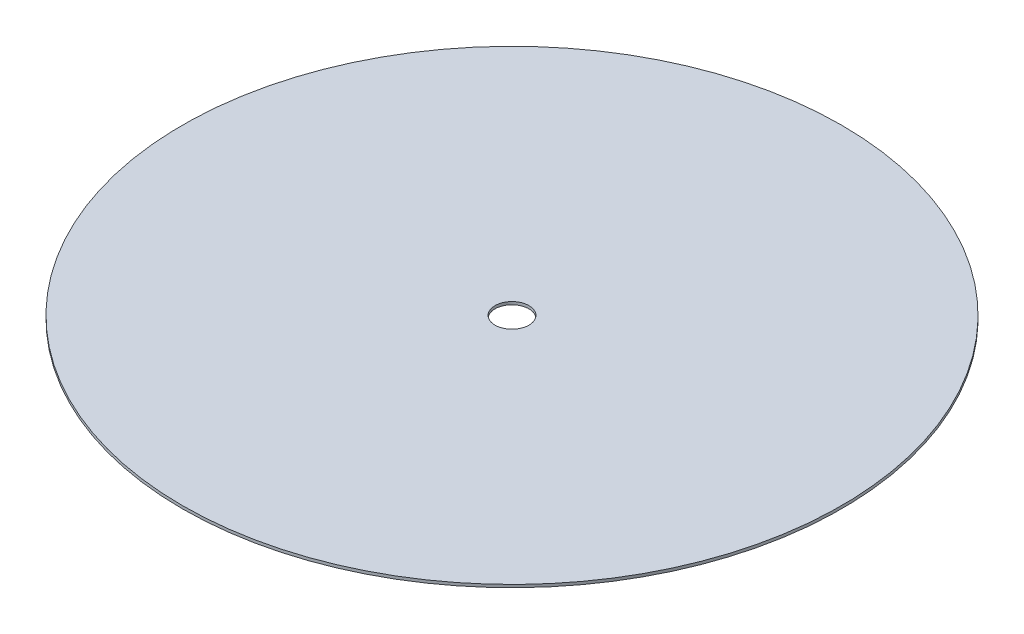
ISO-10303-21;
HEADER;
FILE_DESCRIPTION(('STEP AP214'),'2;1');
FILE_NAME('part.step','',(''),(''),'','','');
FILE_SCHEMA(('AUTOMOTIVE_DESIGN { 1 0 10303 214 1 1 1 1 }'));
ENDSEC;
DATA;
#1=APPLICATION_CONTEXT('core data for automotive mechanical design processes');
#2=APPLICATION_PROTOCOL_DEFINITION('international standard','automotive_design',2000,#1);
#3=PRODUCT_CONTEXT('',#1,'mechanical');
#4=PRODUCT('Part','Part','',(#3));
#5=PRODUCT_RELATED_PRODUCT_CATEGORY('part','',(#4));
#6=PRODUCT_DEFINITION_FORMATION('','',#4);
#7=PRODUCT_DEFINITION_CONTEXT('part definition',#1,'design');
#8=PRODUCT_DEFINITION('design','',#6,#7);
#9=PRODUCT_DEFINITION_SHAPE('','',#8);
#10=(LENGTH_UNIT() NAMED_UNIT(*) SI_UNIT(.MILLI.,.METRE.));
#11=(NAMED_UNIT(*) PLANE_ANGLE_UNIT() SI_UNIT($,.RADIAN.));
#12=(NAMED_UNIT(*) SI_UNIT($,.STERADIAN.) SOLID_ANGLE_UNIT());
#13=UNCERTAINTY_MEASURE_WITH_UNIT(LENGTH_MEASURE(1.E-05),#10,'distance_accuracy_value','');
#14=(GEOMETRIC_REPRESENTATION_CONTEXT(3) GLOBAL_UNCERTAINTY_ASSIGNED_CONTEXT((#13)) GLOBAL_UNIT_ASSIGNED_CONTEXT((#10,
#11,#12)) REPRESENTATION_CONTEXT('',''));
#15=CARTESIAN_POINT('',(0.,0.,0.));
#16=DIRECTION('',(0.,0.,1.));
#17=DIRECTION('',(1.,0.,0.));
#18=AXIS2_PLACEMENT_3D('',#15,#16,#17);
#19=CARTESIAN_POINT('',(0.,15.,0.));
#20=DIRECTION('',(0.,-1.,0.));
#21=DIRECTION('',(0.,0.,-1.));
#22=AXIS2_PLACEMENT_3D('',#19,#20,#21);
#23=CYLINDRICAL_SURFACE('',#22,1750.);
#24=CARTESIAN_POINT('',(0.,15.,0.));
#25=DIRECTION('',(0.,1.,0.));
#26=DIRECTION('',(0.,0.,1.));
#27=AXIS2_PLACEMENT_3D('',#24,#25,#26);
#28=CIRCLE('',#27,1750.);
#29=CARTESIAN_POINT('',(0.,15.,1750.));
#30=VERTEX_POINT('',#29);
#31=EDGE_CURVE('E10',#30,#30,#28,.T.);
#32=ORIENTED_EDGE('',*,*,#31,.F.);
#33=EDGE_LOOP('',(#32));
#34=FACE_BOUND('',#33,.T.);
#35=CARTESIAN_POINT('',(0.,0.,0.));
#36=DIRECTION('',(0.,1.,0.));
#37=DIRECTION('',(0.,0.,1.));
#38=AXIS2_PLACEMENT_3D('',#35,#36,#37);
#39=CIRCLE('',#38,1750.);
#40=CARTESIAN_POINT('',(0.,0.,1750.));
#41=VERTEX_POINT('',#40);
#42=EDGE_CURVE('E44',#41,#41,#39,.T.);
#43=ORIENTED_EDGE('',*,*,#42,.T.);
#44=EDGE_LOOP('',(#43));
#45=FACE_BOUND('',#44,.T.);
#46=ADVANCED_FACE('F36',(#34,#45),#23,.T.);
#47=CARTESIAN_POINT('',(0.,15.,0.));
#48=DIRECTION('',(0.,1.,0.));
#49=DIRECTION('',(0.,0.,1.));
#50=AXIS2_PLACEMENT_3D('',#47,#48,#49);
#51=PLANE('',#50);
#52=CARTESIAN_POINT('',(0.,15.,0.));
#53=DIRECTION('',(0.,1.,0.));
#54=DIRECTION('',(0.,0.,-1.));
#55=AXIS2_PLACEMENT_3D('',#52,#53,#54);
#56=CIRCLE('',#55,89.9999999999999);
#57=CARTESIAN_POINT('',(0.,15.,-89.9999999999999));
#58=VERTEX_POINT('',#57);
#59=EDGE_CURVE('E51',#58,#58,#56,.T.);
#60=ORIENTED_EDGE('',*,*,#59,.F.);
#61=EDGE_LOOP('',(#60));
#62=FACE_BOUND('',#61,.T.);
#63=ORIENTED_EDGE('',*,*,#31,.T.);
#64=EDGE_LOOP('',(#63));
#65=FACE_BOUND('',#64,.T.);
#66=ADVANCED_FACE('F70',(#62,#65),#51,.T.);
#67=CARTESIAN_POINT('',(0.,0.,0.));
#68=DIRECTION('',(0.,1.,0.));
#69=DIRECTION('',(0.,0.,1.));
#70=AXIS2_PLACEMENT_3D('',#67,#68,#69);
#71=PLANE('',#70);
#72=CARTESIAN_POINT('',(0.,0.,0.));
#73=DIRECTION('',(0.,1.,0.));
#74=DIRECTION('',(0.,0.,1.));
#75=AXIS2_PLACEMENT_3D('',#72,#73,#74);
#76=CIRCLE('',#75,89.9999999999999);
#77=CARTESIAN_POINT('',(0.,0.,89.9999999999999));
#78=VERTEX_POINT('',#77);
#79=EDGE_CURVE('E39',#78,#78,#76,.T.);
#80=ORIENTED_EDGE('',*,*,#79,.T.);
#81=EDGE_LOOP('',(#80));
#82=FACE_BOUND('',#81,.T.);
#83=ORIENTED_EDGE('',*,*,#42,.F.);
#84=EDGE_LOOP('',(#83));
#85=FACE_BOUND('',#84,.T.);
#86=ADVANCED_FACE('F60',(#82,#85),#71,.F.);
#87=CARTESIAN_POINT('',(0.,-35.,0.));
#88=DIRECTION('',(0.,1.,0.));
#89=DIRECTION('',(0.,0.,1.));
#90=AXIS2_PLACEMENT_3D('',#87,#88,#89);
#91=CYLINDRICAL_SURFACE('',#90,89.9999999999999);
#92=ORIENTED_EDGE('',*,*,#59,.T.);
#93=EDGE_LOOP('',(#92));
#94=FACE_BOUND('',#93,.T.);
#95=ORIENTED_EDGE('',*,*,#79,.F.);
#96=EDGE_LOOP('',(#95));
#97=FACE_BOUND('',#96,.T.);
#98=ADVANCED_FACE('F63',(#94,#97),#91,.F.);
#99=CLOSED_SHELL('',(#46,#66,#86,#98));
#100=MANIFOLD_SOLID_BREP('B2',#99);
#101=ADVANCED_BREP_SHAPE_REPRESENTATION('',(#18,#100),#14);
#102=SHAPE_DEFINITION_REPRESENTATION(#9,#101);
ENDSEC;
END-ISO-10303-21;
